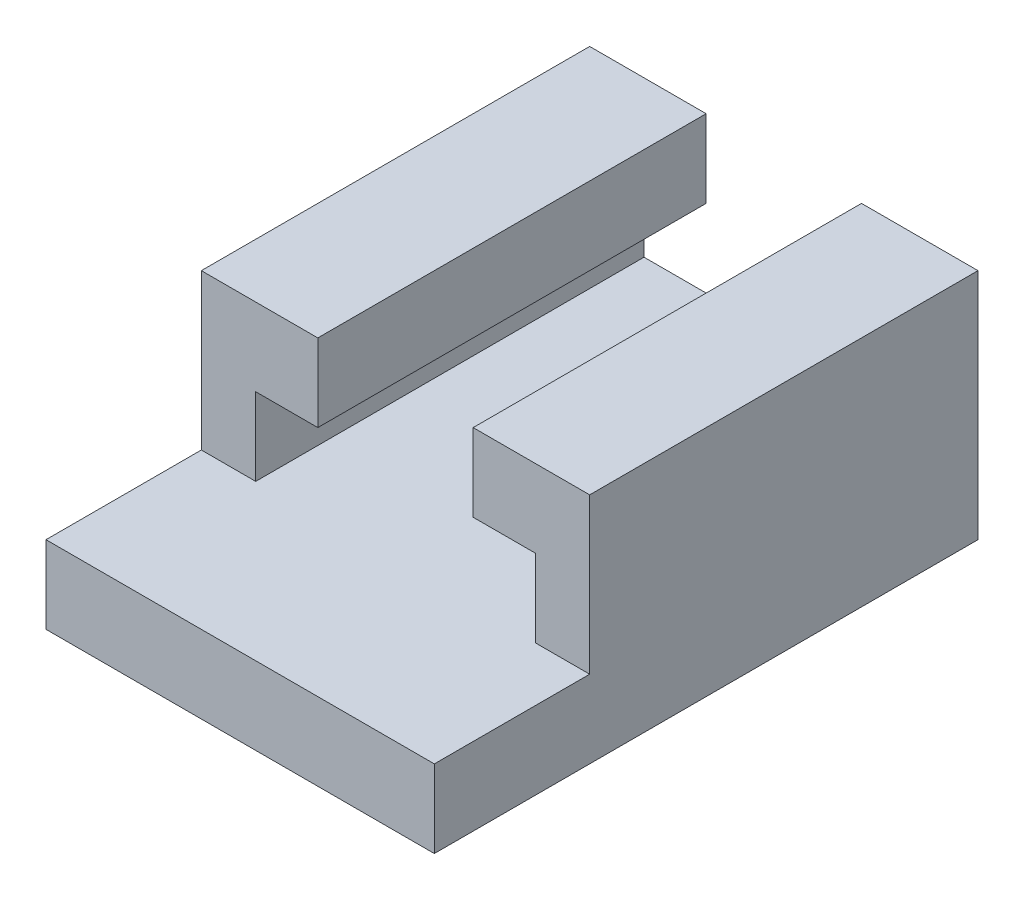
ISO-10303-21;
HEADER;
FILE_DESCRIPTION(('STEP AP214'),'2;1');
FILE_NAME('part.step','',(''),(''),'','','');
FILE_SCHEMA(('AUTOMOTIVE_DESIGN { 1 0 10303 214 1 1 1 1 }'));
ENDSEC;
DATA;
#1=APPLICATION_CONTEXT('core data for automotive mechanical design processes');
#2=APPLICATION_PROTOCOL_DEFINITION('international standard','automotive_design',2000,#1);
#3=PRODUCT_CONTEXT('',#1,'mechanical');
#4=PRODUCT('Part','Part','',(#3));
#5=PRODUCT_RELATED_PRODUCT_CATEGORY('part','',(#4));
#6=PRODUCT_DEFINITION_FORMATION('','',#4);
#7=PRODUCT_DEFINITION_CONTEXT('part definition',#1,'design');
#8=PRODUCT_DEFINITION('design','',#6,#7);
#9=PRODUCT_DEFINITION_SHAPE('','',#8);
#10=(LENGTH_UNIT() NAMED_UNIT(*) SI_UNIT(.MILLI.,.METRE.));
#11=(NAMED_UNIT(*) PLANE_ANGLE_UNIT() SI_UNIT($,.RADIAN.));
#12=(NAMED_UNIT(*) SI_UNIT($,.STERADIAN.) SOLID_ANGLE_UNIT());
#13=UNCERTAINTY_MEASURE_WITH_UNIT(LENGTH_MEASURE(1.E-05),#10,'distance_accuracy_value','');
#14=(GEOMETRIC_REPRESENTATION_CONTEXT(3) GLOBAL_UNCERTAINTY_ASSIGNED_CONTEXT((#13)) GLOBAL_UNIT_ASSIGNED_CONTEXT((#10,
#11,#12)) REPRESENTATION_CONTEXT('',''));
#15=CARTESIAN_POINT('',(0.,0.,0.));
#16=DIRECTION('',(0.,0.,1.));
#17=DIRECTION('',(1.,0.,0.));
#18=AXIS2_PLACEMENT_3D('',#15,#16,#17);
#19=CARTESIAN_POINT('',(0.,3.,0.));
#20=DIRECTION('',(0.,-1.,0.));
#21=DIRECTION('',(0.,0.,-1.));
#22=AXIS2_PLACEMENT_3D('',#19,#20,#21);
#23=PLANE('',#22);
#24=DIRECTION('',(-1.,0.,0.));
#25=VECTOR('',#24,1.);
#26=CARTESIAN_POINT('',(4.3827353128677,3.,-3.85179406139713));
#27=LINE('',#26,#25);
#28=CARTESIAN_POINT('',(0.882735312867699,3.,-3.85179406139713));
#29=VERTEX_POINT('',#28);
#30=CARTESIAN_POINT('',(-0.617264687132302,3.,-3.85179406139713));
#31=VERTEX_POINT('',#30);
#32=EDGE_CURVE('E144',#29,#31,#27,.T.);
#33=ORIENTED_EDGE('',*,*,#32,.F.);
#34=DIRECTION('',(0.,0.,1.));
#35=VECTOR('',#34,1.);
#36=CARTESIAN_POINT('',(0.882735312867698,3.,-8.85179406139713));
#37=LINE('',#36,#35);
#38=CARTESIAN_POINT('',(0.882735312867698,3.,-8.85179406139713));
#39=VERTEX_POINT('',#38);
#40=EDGE_CURVE('E222',#39,#29,#37,.T.);
#41=ORIENTED_EDGE('',*,*,#40,.F.);
#42=DIRECTION('',(1.,0.,0.));
#43=VECTOR('',#42,1.);
#44=CARTESIAN_POINT('',(-0.617264687132302,3.,-8.85179406139713));
#45=LINE('',#44,#43);
#46=CARTESIAN_POINT('',(-0.617264687132302,3.,-8.85179406139713));
#47=VERTEX_POINT('',#46);
#48=EDGE_CURVE('E160',#47,#39,#45,.T.);
#49=ORIENTED_EDGE('',*,*,#48,.F.);
#50=DIRECTION('',(0.,0.,-1.));
#51=VECTOR('',#50,1.);
#52=CARTESIAN_POINT('',(-0.617264687132302,3.,-1.85179406139713));
#53=LINE('',#52,#51);
#54=EDGE_CURVE('E180',#31,#47,#53,.T.);
#55=ORIENTED_EDGE('',*,*,#54,.F.);
#56=EDGE_LOOP('',(#33,#41,#49,#55));
#57=FACE_BOUND('',#56,.T.);
#58=ADVANCED_FACE('F35',(#57),#23,.F.);
#59=CARTESIAN_POINT('',(4.3827353128677,3.,-3.85179406139713));
#60=VERTEX_POINT('',#59);
#61=CARTESIAN_POINT('',(2.8827353128677,3.,-3.85179406139713));
#62=VERTEX_POINT('',#61);
#63=EDGE_CURVE('E136',#60,#62,#27,.T.);
#64=ORIENTED_EDGE('',*,*,#63,.F.);
#65=DIRECTION('',(0.,0.,-1.));
#66=VECTOR('',#65,1.);
#67=CARTESIAN_POINT('',(4.3827353128677,3.,-1.85179406139713));
#68=LINE('',#67,#66);
#69=CARTESIAN_POINT('',(4.3827353128677,3.,-8.85179406139713));
#70=VERTEX_POINT('',#69);
#71=EDGE_CURVE('E150',#60,#70,#68,.T.);
#72=ORIENTED_EDGE('',*,*,#71,.T.);
#73=CARTESIAN_POINT('',(2.8827353128677,3.,-8.85179406139713));
#74=VERTEX_POINT('',#73);
#75=EDGE_CURVE('E164',#74,#70,#45,.T.);
#76=ORIENTED_EDGE('',*,*,#75,.F.);
#77=DIRECTION('',(0.,0.,-1.));
#78=VECTOR('',#77,1.);
#79=CARTESIAN_POINT('',(2.8827353128677,3.,-8.85179406139713));
#80=LINE('',#79,#78);
#81=EDGE_CURVE('E152',#62,#74,#80,.T.);
#82=ORIENTED_EDGE('',*,*,#81,.F.);
#83=EDGE_LOOP('',(#64,#72,#76,#82));
#84=FACE_BOUND('',#83,.T.);
#85=ADVANCED_FACE('F148',(#84),#23,.F.);
#86=CARTESIAN_POINT('',(0.882735312867698,1.,-8.85179406139713));
#87=DIRECTION('',(-1.,0.,0.));
#88=DIRECTION('',(0.,0.,1.));
#89=AXIS2_PLACEMENT_3D('',#86,#87,#88);
#90=PLANE('',#89);
#91=DIRECTION('',(0.,1.,0.));
#92=VECTOR('',#91,1.);
#93=CARTESIAN_POINT('',(0.882735312867699,1.,-3.85179406139713));
#94=LINE('',#93,#92);
#95=CARTESIAN_POINT('',(0.8827353128677,2.,-3.85179406139713));
#96=VERTEX_POINT('',#95);
#97=EDGE_CURVE('E253',#96,#29,#94,.T.);
#98=ORIENTED_EDGE('',*,*,#97,.F.);
#99=DIRECTION('',(0.,0.,-1.));
#100=VECTOR('',#99,1.);
#101=CARTESIAN_POINT('',(0.882735312867698,2.,-8.85179406139713));
#102=LINE('',#101,#100);
#103=CARTESIAN_POINT('',(0.882735312867699,2.,-8.85179406139713));
#104=VERTEX_POINT('',#103);
#105=EDGE_CURVE('E215',#96,#104,#102,.T.);
#106=ORIENTED_EDGE('',*,*,#105,.T.);
#107=DIRECTION('',(0.,1.,0.));
#108=VECTOR('',#107,1.);
#109=CARTESIAN_POINT('',(0.882735312867698,1.,-8.85179406139713));
#110=LINE('',#109,#108);
#111=EDGE_CURVE('E172',#104,#39,#110,.T.);
#112=ORIENTED_EDGE('',*,*,#111,.T.);
#113=ORIENTED_EDGE('',*,*,#40,.T.);
#114=EDGE_LOOP('',(#98,#106,#112,#113));
#115=FACE_BOUND('',#114,.T.);
#116=ADVANCED_FACE('F252',(#115),#90,.F.);
#117=CARTESIAN_POINT('',(2.8827353128677,1.,-8.85179406139713));
#118=DIRECTION('',(1.,0.,0.));
#119=DIRECTION('',(0.,0.,-1.));
#120=AXIS2_PLACEMENT_3D('',#117,#118,#119);
#121=PLANE('',#120);
#122=DIRECTION('',(0.,-1.,0.));
#123=VECTOR('',#122,1.);
#124=CARTESIAN_POINT('',(2.8827353128677,1.,-3.85179406139713));
#125=LINE('',#124,#123);
#126=CARTESIAN_POINT('',(2.8827353128677,2.,-3.85179406139713));
#127=VERTEX_POINT('',#126);
#128=EDGE_CURVE('E189',#62,#127,#125,.T.);
#129=ORIENTED_EDGE('',*,*,#128,.F.);
#130=ORIENTED_EDGE('',*,*,#81,.T.);
#131=DIRECTION('',(0.,1.,0.));
#132=VECTOR('',#131,1.);
#133=CARTESIAN_POINT('',(2.8827353128677,1.,-8.85179406139713));
#134=LINE('',#133,#132);
#135=CARTESIAN_POINT('',(2.8827353128677,2.,-8.85179406139713));
#136=VERTEX_POINT('',#135);
#137=EDGE_CURVE('E191',#136,#74,#134,.T.);
#138=ORIENTED_EDGE('',*,*,#137,.F.);
#139=DIRECTION('',(0.,0.,1.));
#140=VECTOR('',#139,1.);
#141=CARTESIAN_POINT('',(2.8827353128677,2.,-8.85179406139713));
#142=LINE('',#141,#140);
#143=EDGE_CURVE('E43',#136,#127,#142,.T.);
#144=ORIENTED_EDGE('',*,*,#143,.T.);
#145=EDGE_LOOP('',(#129,#130,#138,#144));
#146=FACE_BOUND('',#145,.T.);
#147=ADVANCED_FACE('F188',(#146),#121,.F.);
#148=CARTESIAN_POINT('',(3.6827353128677,2.,-1.85179406139713));
#149=DIRECTION('',(0.,1.,0.));
#150=DIRECTION('',(0.,0.,1.));
#151=AXIS2_PLACEMENT_3D('',#148,#149,#150);
#152=PLANE('',#151);
#153=DIRECTION('',(1.,0.,0.));
#154=VECTOR('',#153,1.);
#155=CARTESIAN_POINT('',(3.6827353128677,2.,-3.85179406139713));
#156=LINE('',#155,#154);
#157=CARTESIAN_POINT('',(3.6827353128677,2.,-3.85179406139713));
#158=VERTEX_POINT('',#157);
#159=EDGE_CURVE('E50',#127,#158,#156,.T.);
#160=ORIENTED_EDGE('',*,*,#159,.F.);
#161=ORIENTED_EDGE('',*,*,#143,.F.);
#162=DIRECTION('',(1.,0.,0.));
#163=VECTOR('',#162,1.);
#164=CARTESIAN_POINT('',(3.6827353128677,2.,-8.85179406139713));
#165=LINE('',#164,#163);
#166=CARTESIAN_POINT('',(3.6827353128677,2.,-8.85179406139713));
#167=VERTEX_POINT('',#166);
#168=EDGE_CURVE('E197',#136,#167,#165,.T.);
#169=ORIENTED_EDGE('',*,*,#168,.T.);
#170=DIRECTION('',(0.,0.,-1.));
#171=VECTOR('',#170,1.);
#172=CARTESIAN_POINT('',(3.6827353128677,2.,-1.85179406139713));
#173=LINE('',#172,#171);
#174=EDGE_CURVE('E213',#158,#167,#173,.T.);
#175=ORIENTED_EDGE('',*,*,#174,.F.);
#176=EDGE_LOOP('',(#160,#161,#169,#175));
#177=FACE_BOUND('',#176,.T.);
#178=ADVANCED_FACE('F195',(#177),#152,.F.);
#179=CARTESIAN_POINT('',(3.6827353128677,2.,-1.85179406139713));
#180=DIRECTION('',(1.,0.,0.));
#181=DIRECTION('',(0.,0.,-1.));
#182=AXIS2_PLACEMENT_3D('',#179,#180,#181);
#183=PLANE('',#182);
#184=DIRECTION('',(0.,-1.,0.));
#185=VECTOR('',#184,1.);
#186=CARTESIAN_POINT('',(3.6827353128677,2.,-3.85179406139713));
#187=LINE('',#186,#185);
#188=CARTESIAN_POINT('',(3.6827353128677,1.,-3.85179406139713));
#189=VERTEX_POINT('',#188);
#190=EDGE_CURVE('E273',#158,#189,#187,.T.);
#191=ORIENTED_EDGE('',*,*,#190,.F.);
#192=ORIENTED_EDGE('',*,*,#174,.T.);
#193=DIRECTION('',(0.,-1.,0.));
#194=VECTOR('',#193,1.);
#195=CARTESIAN_POINT('',(3.6827353128677,2.,-8.85179406139713));
#196=LINE('',#195,#194);
#197=CARTESIAN_POINT('',(3.6827353128677,1.,-8.85179406139713));
#198=VERTEX_POINT('',#197);
#199=EDGE_CURVE('E203',#167,#198,#196,.T.);
#200=ORIENTED_EDGE('',*,*,#199,.T.);
#201=DIRECTION('',(0.,0.,-1.));
#202=VECTOR('',#201,1.);
#203=CARTESIAN_POINT('',(3.6827353128677,1.,-1.85179406139713));
#204=LINE('',#203,#202);
#205=EDGE_CURVE('E208',#189,#198,#204,.T.);
#206=ORIENTED_EDGE('',*,*,#205,.F.);
#207=EDGE_LOOP('',(#191,#192,#200,#206));
#208=FACE_BOUND('',#207,.T.);
#209=ADVANCED_FACE('F269',(#208),#183,.F.);
#210=DIRECTION('',(1.,0.,0.));
#211=VECTOR('',#210,1.);
#212=CARTESIAN_POINT('',(3.6827353128677,2.,-3.85179406139713));
#213=LINE('',#212,#211);
#214=CARTESIAN_POINT('',(0.0827353128676982,2.,-3.85179406139713));
#215=VERTEX_POINT('',#214);
#216=EDGE_CURVE('E261',#215,#96,#213,.T.);
#217=ORIENTED_EDGE('',*,*,#216,.F.);
#218=DIRECTION('',(0.,0.,-1.));
#219=VECTOR('',#218,1.);
#220=CARTESIAN_POINT('',(0.0827353128676982,2.,-1.85179406139713));
#221=LINE('',#220,#219);
#222=CARTESIAN_POINT('',(0.0827353128676982,2.,-8.85179406139713));
#223=VERTEX_POINT('',#222);
#224=EDGE_CURVE('E216',#215,#223,#221,.T.);
#225=ORIENTED_EDGE('',*,*,#224,.T.);
#226=EDGE_CURVE('E204',#223,#104,#165,.T.);
#227=ORIENTED_EDGE('',*,*,#226,.T.);
#228=ORIENTED_EDGE('',*,*,#105,.F.);
#229=EDGE_LOOP('',(#217,#225,#227,#228));
#230=FACE_BOUND('',#229,.T.);
#231=ADVANCED_FACE('F259',(#230),#152,.F.);
#232=CARTESIAN_POINT('',(0.0827353128676982,2.,-1.85179406139713));
#233=DIRECTION('',(-1.,0.,0.));
#234=DIRECTION('',(0.,-1.,0.));
#235=AXIS2_PLACEMENT_3D('',#232,#233,#234);
#236=PLANE('',#235);
#237=DIRECTION('',(0.,1.,0.));
#238=VECTOR('',#237,1.);
#239=CARTESIAN_POINT('',(0.0827353128676982,2.,-3.85179406139713));
#240=LINE('',#239,#238);
#241=CARTESIAN_POINT('',(0.0827353128676983,1.,-3.85179406139713));
#242=VERTEX_POINT('',#241);
#243=EDGE_CURVE('E11',#242,#215,#240,.T.);
#244=ORIENTED_EDGE('',*,*,#243,.F.);
#245=DIRECTION('',(0.,0.,-1.));
#246=VECTOR('',#245,1.);
#247=CARTESIAN_POINT('',(0.0827353128676983,1.,-1.85179406139713));
#248=LINE('',#247,#246);
#249=CARTESIAN_POINT('',(0.0827353128676983,1.,-8.85179406139713));
#250=VERTEX_POINT('',#249);
#251=EDGE_CURVE('E218',#242,#250,#248,.T.);
#252=ORIENTED_EDGE('',*,*,#251,.T.);
#253=DIRECTION('',(0.,1.,0.));
#254=VECTOR('',#253,1.);
#255=CARTESIAN_POINT('',(0.0827353128676982,2.,-8.85179406139713));
#256=LINE('',#255,#254);
#257=EDGE_CURVE('E205',#250,#223,#256,.T.);
#258=ORIENTED_EDGE('',*,*,#257,.T.);
#259=ORIENTED_EDGE('',*,*,#224,.F.);
#260=EDGE_LOOP('',(#244,#252,#258,#259));
#261=FACE_BOUND('',#260,.T.);
#262=ADVANCED_FACE('F263',(#261),#236,.F.);
#263=CARTESIAN_POINT('',(-0.617264687132302,3.,-1.85179406139713));
#264=DIRECTION('',(-1.,0.,0.));
#265=DIRECTION('',(0.,0.,1.));
#266=AXIS2_PLACEMENT_3D('',#263,#264,#265);
#267=PLANE('',#266);
#268=DIRECTION('',(0.,0.,1.));
#269=VECTOR('',#268,1.);
#270=CARTESIAN_POINT('',(-0.617264687132302,0.999999999999999,-3.85179406139713));
#271=LINE('',#270,#269);
#272=CARTESIAN_POINT('',(-0.617264687132302,0.999999999999999,-3.85179406139713));
#273=VERTEX_POINT('',#272);
#274=CARTESIAN_POINT('',(-0.617264687132302,0.999999999999999,-1.85179406139713));
#275=VERTEX_POINT('',#274);
#276=EDGE_CURVE('E278',#273,#275,#271,.T.);
#277=ORIENTED_EDGE('',*,*,#276,.F.);
#278=DIRECTION('',(0.,-1.,0.));
#279=VECTOR('',#278,1.);
#280=CARTESIAN_POINT('',(-0.617264687132302,0.999999999999999,-3.85179406139713));
#281=LINE('',#280,#279);
#282=EDGE_CURVE('E153',#31,#273,#281,.T.);
#283=ORIENTED_EDGE('',*,*,#282,.F.);
#284=ORIENTED_EDGE('',*,*,#54,.T.);
#285=DIRECTION('',(0.,-1.,0.));
#286=VECTOR('',#285,1.);
#287=CARTESIAN_POINT('',(-0.617264687132302,3.,-8.85179406139713));
#288=LINE('',#287,#286);
#289=CARTESIAN_POINT('',(-0.617264687132302,0.,-8.85179406139713));
#290=VERTEX_POINT('',#289);
#291=EDGE_CURVE('E159',#47,#290,#288,.T.);
#292=ORIENTED_EDGE('',*,*,#291,.T.);
#293=DIRECTION('',(0.,0.,-1.));
#294=VECTOR('',#293,1.);
#295=CARTESIAN_POINT('',(-0.617264687132302,0.,-1.85179406139713));
#296=LINE('',#295,#294);
#297=CARTESIAN_POINT('',(-0.617264687132302,0.,-1.85179406139713));
#298=VERTEX_POINT('',#297);
#299=EDGE_CURVE('E168',#298,#290,#296,.T.);
#300=ORIENTED_EDGE('',*,*,#299,.F.);
#301=DIRECTION('',(0.,-1.,0.));
#302=VECTOR('',#301,1.);
#303=CARTESIAN_POINT('',(-0.617264687132302,3.,-1.85179406139713));
#304=LINE('',#303,#302);
#305=EDGE_CURVE('E181',#275,#298,#304,.T.);
#306=ORIENTED_EDGE('',*,*,#305,.F.);
#307=EDGE_LOOP('',(#277,#283,#284,#292,#300,#306));
#308=FACE_BOUND('',#307,.T.);
#309=ADVANCED_FACE('F37',(#308),#267,.T.);
#310=CARTESIAN_POINT('',(-0.617264687132302,3.,-1.85179406139713));
#311=DIRECTION('',(0.,0.,-1.));
#312=DIRECTION('',(-1.,0.,0.));
#313=AXIS2_PLACEMENT_3D('',#310,#311,#312);
#314=PLANE('',#313);
#315=DIRECTION('',(0.,-1.,0.));
#316=VECTOR('',#315,1.);
#317=CARTESIAN_POINT('',(4.3827353128677,3.,-1.85179406139713));
#318=LINE('',#317,#316);
#319=CARTESIAN_POINT('',(4.3827353128677,1.,-1.85179406139713));
#320=VERTEX_POINT('',#319);
#321=CARTESIAN_POINT('',(4.3827353128677,0.,-1.85179406139713));
#322=VERTEX_POINT('',#321);
#323=EDGE_CURVE('E183',#320,#322,#318,.T.);
#324=ORIENTED_EDGE('',*,*,#323,.F.);
#325=DIRECTION('',(1.,0.,0.));
#326=VECTOR('',#325,1.);
#327=CARTESIAN_POINT('',(0.882735312867699,1.,-1.85179406139713));
#328=LINE('',#327,#326);
#329=EDGE_CURVE('E223',#275,#320,#328,.T.);
#330=ORIENTED_EDGE('',*,*,#329,.F.);
#331=ORIENTED_EDGE('',*,*,#305,.T.);
#332=DIRECTION('',(1.,0.,0.));
#333=VECTOR('',#332,1.);
#334=CARTESIAN_POINT('',(-0.617264687132302,0.,-1.85179406139713));
#335=LINE('',#334,#333);
#336=EDGE_CURVE('E177',#298,#322,#335,.T.);
#337=ORIENTED_EDGE('',*,*,#336,.T.);
#338=EDGE_LOOP('',(#324,#330,#331,#337));
#339=FACE_BOUND('',#338,.T.);
#340=ADVANCED_FACE('F285',(#339),#314,.F.);
#341=CARTESIAN_POINT('',(4.3827353128677,3.,-1.85179406139713));
#342=DIRECTION('',(-1.,0.,0.));
#343=DIRECTION('',(0.,0.,1.));
#344=AXIS2_PLACEMENT_3D('',#341,#342,#343);
#345=PLANE('',#344);
#346=DIRECTION('',(0.,1.,0.));
#347=VECTOR('',#346,1.);
#348=CARTESIAN_POINT('',(4.3827353128677,1.,-3.85179406139713));
#349=LINE('',#348,#347);
#350=CARTESIAN_POINT('',(4.3827353128677,1.,-3.85179406139713));
#351=VERTEX_POINT('',#350);
#352=EDGE_CURVE('E133',#351,#60,#349,.T.);
#353=ORIENTED_EDGE('',*,*,#352,.F.);
#354=DIRECTION('',(0.,0.,1.));
#355=VECTOR('',#354,1.);
#356=CARTESIAN_POINT('',(4.3827353128677,1.,-3.85179406139713));
#357=LINE('',#356,#355);
#358=EDGE_CURVE('E277',#351,#320,#357,.T.);
#359=ORIENTED_EDGE('',*,*,#358,.T.);
#360=ORIENTED_EDGE('',*,*,#323,.T.);
#361=DIRECTION('',(0.,0.,-1.));
#362=VECTOR('',#361,1.);
#363=CARTESIAN_POINT('',(4.3827353128677,0.,-1.85179406139713));
#364=LINE('',#363,#362);
#365=CARTESIAN_POINT('',(4.3827353128677,0.,-8.85179406139713));
#366=VERTEX_POINT('',#365);
#367=EDGE_CURVE('E175',#322,#366,#364,.T.);
#368=ORIENTED_EDGE('',*,*,#367,.T.);
#369=DIRECTION('',(0.,-1.,0.));
#370=VECTOR('',#369,1.);
#371=CARTESIAN_POINT('',(4.3827353128677,3.,-8.85179406139713));
#372=LINE('',#371,#370);
#373=EDGE_CURVE('E158',#70,#366,#372,.T.);
#374=ORIENTED_EDGE('',*,*,#373,.F.);
#375=ORIENTED_EDGE('',*,*,#71,.F.);
#376=EDGE_LOOP('',(#353,#359,#360,#368,#374,#375));
#377=FACE_BOUND('',#376,.T.);
#378=ADVANCED_FACE('F156',(#377),#345,.F.);
#379=CARTESIAN_POINT('',(-0.617264687132302,3.,-8.85179406139713));
#380=DIRECTION('',(0.,0.,-1.));
#381=DIRECTION('',(-1.,0.,0.));
#382=AXIS2_PLACEMENT_3D('',#379,#380,#381);
#383=PLANE('',#382);
#384=ORIENTED_EDGE('',*,*,#168,.F.);
#385=ORIENTED_EDGE('',*,*,#137,.T.);
#386=ORIENTED_EDGE('',*,*,#75,.T.);
#387=ORIENTED_EDGE('',*,*,#373,.T.);
#388=DIRECTION('',(1.,0.,0.));
#389=VECTOR('',#388,1.);
#390=CARTESIAN_POINT('',(-0.617264687132302,0.,-8.85179406139713));
#391=LINE('',#390,#389);
#392=EDGE_CURVE('E171',#290,#366,#391,.T.);
#393=ORIENTED_EDGE('',*,*,#392,.F.);
#394=ORIENTED_EDGE('',*,*,#291,.F.);
#395=ORIENTED_EDGE('',*,*,#48,.T.);
#396=ORIENTED_EDGE('',*,*,#111,.F.);
#397=ORIENTED_EDGE('',*,*,#226,.F.);
#398=ORIENTED_EDGE('',*,*,#257,.F.);
#399=DIRECTION('',(-1.,0.,0.));
#400=VECTOR('',#399,1.);
#401=CARTESIAN_POINT('',(0.882735312867698,1.,-8.85179406139713));
#402=LINE('',#401,#400);
#403=EDGE_CURVE('E225',#198,#250,#402,.T.);
#404=ORIENTED_EDGE('',*,*,#403,.F.);
#405=ORIENTED_EDGE('',*,*,#199,.F.);
#406=EDGE_LOOP('',(#384,#385,#386,#387,#393,#394,#395,#396,#397,#398,#404,#405));
#407=FACE_BOUND('',#406,.T.);
#408=ADVANCED_FACE('F200',(#407),#383,.T.);
#409=CARTESIAN_POINT('',(0.,0.,0.));
#410=DIRECTION('',(0.,-1.,0.));
#411=DIRECTION('',(0.,0.,-1.));
#412=AXIS2_PLACEMENT_3D('',#409,#410,#411);
#413=PLANE('',#412);
#414=ORIENTED_EDGE('',*,*,#299,.T.);
#415=ORIENTED_EDGE('',*,*,#392,.T.);
#416=ORIENTED_EDGE('',*,*,#367,.F.);
#417=ORIENTED_EDGE('',*,*,#336,.F.);
#418=EDGE_LOOP('',(#414,#415,#416,#417));
#419=FACE_BOUND('',#418,.T.);
#420=ADVANCED_FACE('F241',(#419),#413,.T.);
#421=CARTESIAN_POINT('',(0.,1.,0.));
#422=DIRECTION('',(0.,1.,0.));
#423=DIRECTION('',(0.,0.,1.));
#424=AXIS2_PLACEMENT_3D('',#421,#422,#423);
#425=PLANE('',#424);
#426=DIRECTION('',(1.,0.,0.));
#427=VECTOR('',#426,1.);
#428=CARTESIAN_POINT('',(4.3827353128677,1.,-3.85179406139713));
#429=LINE('',#428,#427);
#430=EDGE_CURVE('E139',#189,#351,#429,.T.);
#431=ORIENTED_EDGE('',*,*,#430,.F.);
#432=ORIENTED_EDGE('',*,*,#205,.T.);
#433=ORIENTED_EDGE('',*,*,#403,.T.);
#434=ORIENTED_EDGE('',*,*,#251,.F.);
#435=EDGE_CURVE('E57',#273,#242,#429,.T.);
#436=ORIENTED_EDGE('',*,*,#435,.F.);
#437=ORIENTED_EDGE('',*,*,#276,.T.);
#438=ORIENTED_EDGE('',*,*,#329,.T.);
#439=ORIENTED_EDGE('',*,*,#358,.F.);
#440=EDGE_LOOP('',(#431,#432,#433,#434,#436,#437,#438,#439));
#441=FACE_BOUND('',#440,.T.);
#442=ADVANCED_FACE('F266',(#441),#425,.T.);
#443=CARTESIAN_POINT('',(0.,0.,-3.85179406139713));
#444=DIRECTION('',(0.,0.,1.));
#445=DIRECTION('',(1.,0.,0.));
#446=AXIS2_PLACEMENT_3D('',#443,#444,#445);
#447=PLANE('',#446);
#448=ORIENTED_EDGE('',*,*,#97,.T.);
#449=ORIENTED_EDGE('',*,*,#32,.T.);
#450=ORIENTED_EDGE('',*,*,#282,.T.);
#451=ORIENTED_EDGE('',*,*,#435,.T.);
#452=ORIENTED_EDGE('',*,*,#243,.T.);
#453=ORIENTED_EDGE('',*,*,#216,.T.);
#454=EDGE_LOOP('',(#448,#449,#450,#451,#452,#453));
#455=FACE_BOUND('',#454,.T.);
#456=ADVANCED_FACE('F283',(#455),#447,.T.);
#457=ORIENTED_EDGE('',*,*,#128,.T.);
#458=ORIENTED_EDGE('',*,*,#159,.T.);
#459=ORIENTED_EDGE('',*,*,#190,.T.);
#460=ORIENTED_EDGE('',*,*,#430,.T.);
#461=ORIENTED_EDGE('',*,*,#352,.T.);
#462=ORIENTED_EDGE('',*,*,#63,.T.);
#463=EDGE_LOOP('',(#457,#458,#459,#460,#461,#462));
#464=FACE_BOUND('',#463,.T.);
#465=ADVANCED_FACE('F135',(#464),#447,.T.);
#466=CLOSED_SHELL('',(#58,#85,#116,#147,#178,#209,#231,#262,#309,#340,#378,#408,#420,#442,#456,#465));
#467=MANIFOLD_SOLID_BREP('B2',#466);
#468=ADVANCED_BREP_SHAPE_REPRESENTATION('',(#18,#467),#14);
#469=SHAPE_DEFINITION_REPRESENTATION(#9,#468);
ENDSEC;
END-ISO-10303-21;
